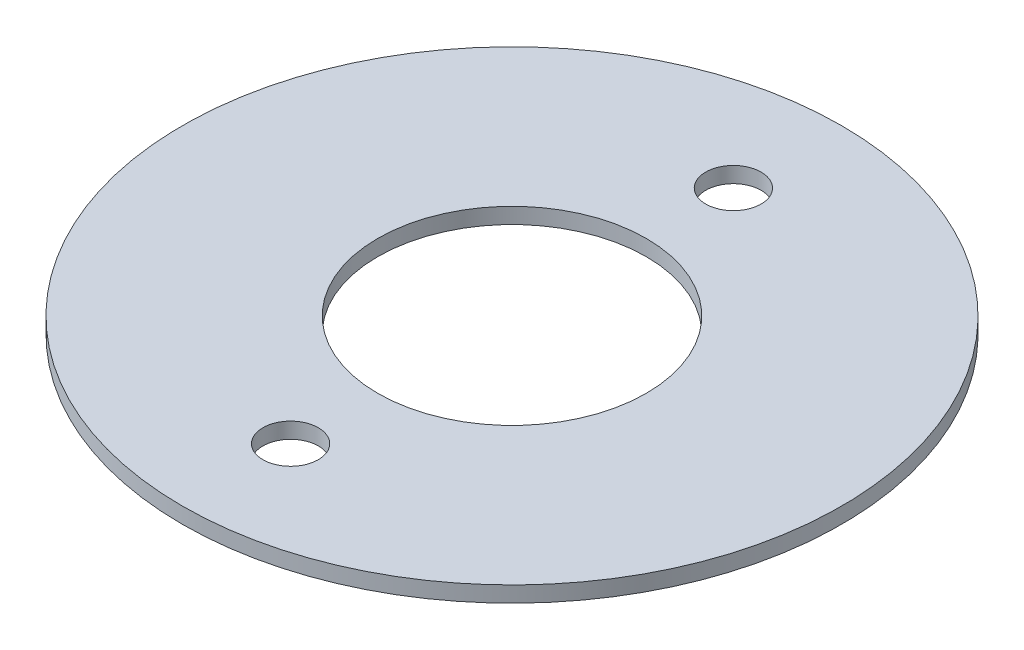
ISO-10303-21;
HEADER;
FILE_DESCRIPTION(('STEP AP214'),'2;1');
FILE_NAME('part.step','',(''),(''),'','','');
FILE_SCHEMA(('AUTOMOTIVE_DESIGN { 1 0 10303 214 1 1 1 1 }'));
ENDSEC;
DATA;
#1=APPLICATION_CONTEXT('core data for automotive mechanical design processes');
#2=APPLICATION_PROTOCOL_DEFINITION('international standard','automotive_design',2000,#1);
#3=PRODUCT_CONTEXT('',#1,'mechanical');
#4=PRODUCT('Part','Part','',(#3));
#5=PRODUCT_RELATED_PRODUCT_CATEGORY('part','',(#4));
#6=PRODUCT_DEFINITION_FORMATION('','',#4);
#7=PRODUCT_DEFINITION_CONTEXT('part definition',#1,'design');
#8=PRODUCT_DEFINITION('design','',#6,#7);
#9=PRODUCT_DEFINITION_SHAPE('','',#8);
#10=(LENGTH_UNIT() NAMED_UNIT(*) SI_UNIT(.MILLI.,.METRE.));
#11=(NAMED_UNIT(*) PLANE_ANGLE_UNIT() SI_UNIT($,.RADIAN.));
#12=(NAMED_UNIT(*) SI_UNIT($,.STERADIAN.) SOLID_ANGLE_UNIT());
#13=UNCERTAINTY_MEASURE_WITH_UNIT(LENGTH_MEASURE(1.E-05),#10,'distance_accuracy_value','');
#14=(GEOMETRIC_REPRESENTATION_CONTEXT(3) GLOBAL_UNCERTAINTY_ASSIGNED_CONTEXT((#13)) GLOBAL_UNIT_ASSIGNED_CONTEXT((#10,
#11,#12)) REPRESENTATION_CONTEXT('',''));
#15=CARTESIAN_POINT('',(0.,0.,0.));
#16=DIRECTION('',(0.,0.,1.));
#17=DIRECTION('',(1.,0.,0.));
#18=AXIS2_PLACEMENT_3D('',#15,#16,#17);
#19=CARTESIAN_POINT('',(0.,3.175,0.));
#20=DIRECTION('',(0.,-1.,0.));
#21=DIRECTION('',(0.,0.,-1.));
#22=AXIS2_PLACEMENT_3D('',#19,#20,#21);
#23=CYLINDRICAL_SURFACE('',#22,66.167);
#24=CARTESIAN_POINT('',(0.,3.175,0.));
#25=DIRECTION('',(0.,1.,0.));
#26=DIRECTION('',(0.,0.,1.));
#27=AXIS2_PLACEMENT_3D('',#24,#25,#26);
#28=CIRCLE('',#27,66.167);
#29=CARTESIAN_POINT('',(0.,3.175,66.167));
#30=VERTEX_POINT('',#29);
#31=EDGE_CURVE('E10',#30,#30,#28,.T.);
#32=ORIENTED_EDGE('',*,*,#31,.F.);
#33=EDGE_LOOP('',(#32));
#34=FACE_BOUND('',#33,.T.);
#35=CARTESIAN_POINT('',(0.,0.,0.));
#36=DIRECTION('',(0.,1.,0.));
#37=DIRECTION('',(0.,0.,1.));
#38=AXIS2_PLACEMENT_3D('',#35,#36,#37);
#39=CIRCLE('',#38,66.167);
#40=CARTESIAN_POINT('',(0.,0.,66.167));
#41=VERTEX_POINT('',#40);
#42=EDGE_CURVE('E38',#41,#41,#39,.T.);
#43=ORIENTED_EDGE('',*,*,#42,.T.);
#44=EDGE_LOOP('',(#43));
#45=FACE_BOUND('',#44,.T.);
#46=ADVANCED_FACE('F35',(#34,#45),#23,.T.);
#47=CARTESIAN_POINT('',(0.,3.175,0.));
#48=DIRECTION('',(0.,1.,0.));
#49=DIRECTION('',(0.,0.,1.));
#50=AXIS2_PLACEMENT_3D('',#47,#48,#49);
#51=PLANE('',#50);
#52=CARTESIAN_POINT('',(0.,3.175,-44.45));
#53=DIRECTION('',(0.,-1.,0.));
#54=DIRECTION('',(0.,0.,-1.));
#55=AXIS2_PLACEMENT_3D('',#52,#53,#54);
#56=CIRCLE('',#55,5.56259999999999);
#57=CARTESIAN_POINT('',(0.,3.175,-50.0126));
#58=VERTEX_POINT('',#57);
#59=EDGE_CURVE('E45',#58,#58,#56,.T.);
#60=ORIENTED_EDGE('',*,*,#59,.T.);
#61=EDGE_LOOP('',(#60));
#62=FACE_BOUND('',#61,.T.);
#63=CARTESIAN_POINT('',(0.,3.175,0.));
#64=DIRECTION('',(0.,-1.,0.));
#65=DIRECTION('',(0.,0.,-1.));
#66=AXIS2_PLACEMENT_3D('',#63,#64,#65);
#67=CIRCLE('',#66,26.9494);
#68=CARTESIAN_POINT('',(0.,3.175,-26.9494));
#69=VERTEX_POINT('',#68);
#70=EDGE_CURVE('E53',#69,#69,#67,.T.);
#71=ORIENTED_EDGE('',*,*,#70,.T.);
#72=EDGE_LOOP('',(#71));
#73=FACE_BOUND('',#72,.T.);
#74=CARTESIAN_POINT('',(0.,3.175,44.45));
#75=DIRECTION('',(0.,-1.,0.));
#76=DIRECTION('',(0.,0.,-1.));
#77=AXIS2_PLACEMENT_3D('',#74,#75,#76);
#78=CIRCLE('',#77,5.56259999999999);
#79=CARTESIAN_POINT('',(0.,3.175,38.8874));
#80=VERTEX_POINT('',#79);
#81=EDGE_CURVE('E47',#80,#80,#78,.T.);
#82=ORIENTED_EDGE('',*,*,#81,.T.);
#83=EDGE_LOOP('',(#82));
#84=FACE_BOUND('',#83,.T.);
#85=ORIENTED_EDGE('',*,*,#31,.T.);
#86=EDGE_LOOP('',(#85));
#87=FACE_BOUND('',#86,.T.);
#88=ADVANCED_FACE('F65',(#62,#73,#84,#87),#51,.T.);
#89=CARTESIAN_POINT('',(0.,0.,0.));
#90=DIRECTION('',(0.,1.,0.));
#91=DIRECTION('',(0.,0.,1.));
#92=AXIS2_PLACEMENT_3D('',#89,#90,#91);
#93=PLANE('',#92);
#94=CARTESIAN_POINT('',(0.,0.,-44.45));
#95=DIRECTION('',(0.,-1.,0.));
#96=DIRECTION('',(0.,0.,-1.));
#97=AXIS2_PLACEMENT_3D('',#94,#95,#96);
#98=CIRCLE('',#97,5.56259999999999);
#99=CARTESIAN_POINT('',(0.,0.,-50.0126));
#100=VERTEX_POINT('',#99);
#101=EDGE_CURVE('E59',#100,#100,#98,.T.);
#102=ORIENTED_EDGE('',*,*,#101,.F.);
#103=EDGE_LOOP('',(#102));
#104=FACE_BOUND('',#103,.T.);
#105=CARTESIAN_POINT('',(0.,0.,0.));
#106=DIRECTION('',(0.,-1.,0.));
#107=DIRECTION('',(0.,0.,-1.));
#108=AXIS2_PLACEMENT_3D('',#105,#106,#107);
#109=CIRCLE('',#108,26.9494);
#110=CARTESIAN_POINT('',(0.,0.,-26.9494));
#111=VERTEX_POINT('',#110);
#112=EDGE_CURVE('E56',#111,#111,#109,.T.);
#113=ORIENTED_EDGE('',*,*,#112,.F.);
#114=EDGE_LOOP('',(#113));
#115=FACE_BOUND('',#114,.T.);
#116=CARTESIAN_POINT('',(0.,0.,44.45));
#117=DIRECTION('',(0.,-1.,0.));
#118=DIRECTION('',(0.,0.,-1.));
#119=AXIS2_PLACEMENT_3D('',#116,#117,#118);
#120=CIRCLE('',#119,5.56259999999999);
#121=CARTESIAN_POINT('',(0.,0.,38.8874));
#122=VERTEX_POINT('',#121);
#123=EDGE_CURVE('E50',#122,#122,#120,.T.);
#124=ORIENTED_EDGE('',*,*,#123,.F.);
#125=EDGE_LOOP('',(#124));
#126=FACE_BOUND('',#125,.T.);
#127=ORIENTED_EDGE('',*,*,#42,.F.);
#128=EDGE_LOOP('',(#127));
#129=FACE_BOUND('',#128,.T.);
#130=ADVANCED_FACE('F75',(#104,#115,#126,#129),#93,.F.);
#131=CARTESIAN_POINT('',(0.,3.175,44.45));
#132=DIRECTION('',(0.,-1.,0.));
#133=DIRECTION('',(0.,0.,-1.));
#134=AXIS2_PLACEMENT_3D('',#131,#132,#133);
#135=CYLINDRICAL_SURFACE('',#134,5.56259999999999);
#136=ORIENTED_EDGE('',*,*,#81,.F.);
#137=EDGE_LOOP('',(#136));
#138=FACE_BOUND('',#137,.T.);
#139=ORIENTED_EDGE('',*,*,#123,.T.);
#140=EDGE_LOOP('',(#139));
#141=FACE_BOUND('',#140,.T.);
#142=ADVANCED_FACE('F78',(#138,#141),#135,.F.);
#143=CARTESIAN_POINT('',(0.,3.175,0.));
#144=DIRECTION('',(0.,-1.,0.));
#145=DIRECTION('',(0.,0.,-1.));
#146=AXIS2_PLACEMENT_3D('',#143,#144,#145);
#147=CYLINDRICAL_SURFACE('',#146,26.9494);
#148=ORIENTED_EDGE('',*,*,#70,.F.);
#149=EDGE_LOOP('',(#148));
#150=FACE_BOUND('',#149,.T.);
#151=ORIENTED_EDGE('',*,*,#112,.T.);
#152=EDGE_LOOP('',(#151));
#153=FACE_BOUND('',#152,.T.);
#154=ADVANCED_FACE('F71',(#150,#153),#147,.F.);
#155=CARTESIAN_POINT('',(0.,3.175,-44.45));
#156=DIRECTION('',(0.,-1.,0.));
#157=DIRECTION('',(0.,0.,-1.));
#158=AXIS2_PLACEMENT_3D('',#155,#156,#157);
#159=CYLINDRICAL_SURFACE('',#158,5.56259999999999);
#160=ORIENTED_EDGE('',*,*,#59,.F.);
#161=EDGE_LOOP('',(#160));
#162=FACE_BOUND('',#161,.T.);
#163=ORIENTED_EDGE('',*,*,#101,.T.);
#164=EDGE_LOOP('',(#163));
#165=FACE_BOUND('',#164,.T.);
#166=ADVANCED_FACE('F68',(#162,#165),#159,.F.);
#167=CLOSED_SHELL('',(#46,#88,#130,#142,#154,#166));
#168=MANIFOLD_SOLID_BREP('B2',#167);
#169=ADVANCED_BREP_SHAPE_REPRESENTATION('',(#18,#168),#14);
#170=SHAPE_DEFINITION_REPRESENTATION(#9,#169);
ENDSEC;
END-ISO-10303-21;
